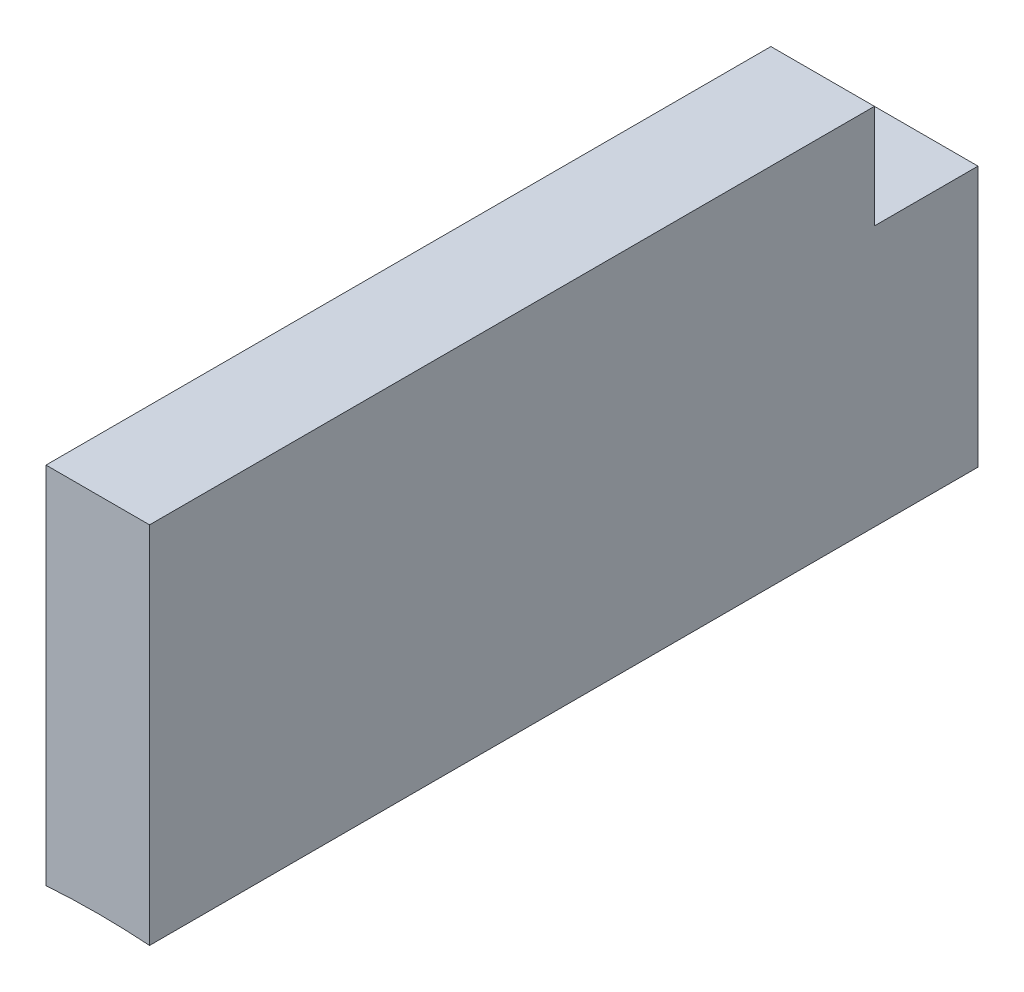
ISO-10303-21;
HEADER;
FILE_DESCRIPTION(('STEP AP214'),'2;1');
FILE_NAME('part.step','',(''),(''),'','','');
FILE_SCHEMA(('AUTOMOTIVE_DESIGN { 1 0 10303 214 1 1 1 1 }'));
ENDSEC;
DATA;
#1=APPLICATION_CONTEXT('core data for automotive mechanical design processes');
#2=APPLICATION_PROTOCOL_DEFINITION('international standard','automotive_design',2000,#1);
#3=PRODUCT_CONTEXT('',#1,'mechanical');
#4=PRODUCT('Part','Part','',(#3));
#5=PRODUCT_RELATED_PRODUCT_CATEGORY('part','',(#4));
#6=PRODUCT_DEFINITION_FORMATION('','',#4);
#7=PRODUCT_DEFINITION_CONTEXT('part definition',#1,'design');
#8=PRODUCT_DEFINITION('design','',#6,#7);
#9=PRODUCT_DEFINITION_SHAPE('','',#8);
#10=(LENGTH_UNIT() NAMED_UNIT(*) SI_UNIT(.MILLI.,.METRE.));
#11=(NAMED_UNIT(*) PLANE_ANGLE_UNIT() SI_UNIT($,.RADIAN.));
#12=(NAMED_UNIT(*) SI_UNIT($,.STERADIAN.) SOLID_ANGLE_UNIT());
#13=UNCERTAINTY_MEASURE_WITH_UNIT(LENGTH_MEASURE(1.E-05),#10,'distance_accuracy_value','');
#14=(GEOMETRIC_REPRESENTATION_CONTEXT(3) GLOBAL_UNCERTAINTY_ASSIGNED_CONTEXT((#13)) GLOBAL_UNIT_ASSIGNED_CONTEXT((#10,
#11,#12)) REPRESENTATION_CONTEXT('',''));
#15=CARTESIAN_POINT('',(0.,0.,0.));
#16=DIRECTION('',(0.,0.,1.));
#17=DIRECTION('',(1.,0.,0.));
#18=AXIS2_PLACEMENT_3D('',#15,#16,#17);
#19=CARTESIAN_POINT('',(-2.5,-53.,40.));
#20=DIRECTION('',(0.,0.,-1.));
#21=DIRECTION('',(-1.,0.,0.));
#22=AXIS2_PLACEMENT_3D('',#19,#20,#21);
#23=CYLINDRICAL_SURFACE('',#22,35.5);
#24=CARTESIAN_POINT('',(-2.5,-53.,0.));
#25=DIRECTION('',(0.,0.,1.));
#26=DIRECTION('',(1.,0.,0.));
#27=AXIS2_PLACEMENT_3D('',#24,#25,#26);
#28=CIRCLE('',#27,35.5);
#29=CARTESIAN_POINT('',(0.,-17.5881375807484,0.));
#30=VERTEX_POINT('',#29);
#31=CARTESIAN_POINT('',(-5.,-17.5881375807484,0.));
#32=VERTEX_POINT('',#31);
#33=EDGE_CURVE('E115',#30,#32,#28,.T.);
#34=ORIENTED_EDGE('',*,*,#33,.F.);
#35=DIRECTION('',(0.,0.,-1.));
#36=VECTOR('',#35,1.);
#37=CARTESIAN_POINT('',(0.,-17.5881375807484,40.));
#38=LINE('',#37,#36);
#39=CARTESIAN_POINT('',(0.,-17.5881375807484,40.));
#40=VERTEX_POINT('',#39);
#41=EDGE_CURVE('E75',#40,#30,#38,.T.);
#42=ORIENTED_EDGE('',*,*,#41,.F.);
#43=CARTESIAN_POINT('',(-2.5,-53.,40.));
#44=DIRECTION('',(0.,0.,1.));
#45=DIRECTION('',(1.,0.,0.));
#46=AXIS2_PLACEMENT_3D('',#43,#44,#45);
#47=CIRCLE('',#46,35.5);
#48=CARTESIAN_POINT('',(-5.,-17.5881375807484,40.));
#49=VERTEX_POINT('',#48);
#50=EDGE_CURVE('E116',#40,#49,#47,.T.);
#51=ORIENTED_EDGE('',*,*,#50,.T.);
#52=DIRECTION('',(0.,0.,-1.));
#53=VECTOR('',#52,1.);
#54=CARTESIAN_POINT('',(-5.,-17.5881375807484,40.));
#55=LINE('',#54,#53);
#56=EDGE_CURVE('E58',#49,#32,#55,.T.);
#57=ORIENTED_EDGE('',*,*,#56,.T.);
#58=EDGE_LOOP('',(#34,#42,#51,#57));
#59=FACE_BOUND('',#58,.T.);
#60=ADVANCED_FACE('F35',(#59),#23,.F.);
#61=CARTESIAN_POINT('',(0.,0.,40.));
#62=DIRECTION('',(-1.,0.,0.));
#63=DIRECTION('',(0.,0.,1.));
#64=AXIS2_PLACEMENT_3D('',#61,#62,#63);
#65=PLANE('',#64);
#66=DIRECTION('',(0.,0.,-1.));
#67=VECTOR('',#66,1.);
#68=CARTESIAN_POINT('',(0.,-5.,5.));
#69=LINE('',#68,#67);
#70=CARTESIAN_POINT('',(0.,-5.,5.));
#71=VERTEX_POINT('',#70);
#72=CARTESIAN_POINT('',(0.,-5.,0.));
#73=VERTEX_POINT('',#72);
#74=EDGE_CURVE('E49',#71,#73,#69,.T.);
#75=ORIENTED_EDGE('',*,*,#74,.F.);
#76=DIRECTION('',(0.,-1.,0.));
#77=VECTOR('',#76,1.);
#78=CARTESIAN_POINT('',(0.,0.,5.));
#79=LINE('',#78,#77);
#80=CARTESIAN_POINT('',(0.,0.,5.));
#81=VERTEX_POINT('',#80);
#82=EDGE_CURVE('E100',#81,#71,#79,.T.);
#83=ORIENTED_EDGE('',*,*,#82,.F.);
#84=DIRECTION('',(0.,0.,-1.));
#85=VECTOR('',#84,1.);
#86=CARTESIAN_POINT('',(0.,0.,40.));
#87=LINE('',#86,#85);
#88=CARTESIAN_POINT('',(0.,0.,40.));
#89=VERTEX_POINT('',#88);
#90=EDGE_CURVE('E134',#89,#81,#87,.T.);
#91=ORIENTED_EDGE('',*,*,#90,.F.);
#92=DIRECTION('',(0.,1.,0.));
#93=VECTOR('',#92,1.);
#94=CARTESIAN_POINT('',(0.,0.,40.));
#95=LINE('',#94,#93);
#96=EDGE_CURVE('E118',#40,#89,#95,.T.);
#97=ORIENTED_EDGE('',*,*,#96,.F.);
#98=ORIENTED_EDGE('',*,*,#41,.T.);
#99=DIRECTION('',(0.,1.,0.));
#100=VECTOR('',#99,1.);
#101=CARTESIAN_POINT('',(0.,0.,0.));
#102=LINE('',#101,#100);
#103=EDGE_CURVE('E110',#30,#73,#102,.T.);
#104=ORIENTED_EDGE('',*,*,#103,.T.);
#105=EDGE_LOOP('',(#75,#83,#91,#97,#98,#104));
#106=FACE_BOUND('',#105,.T.);
#107=ADVANCED_FACE('F108',(#106),#65,.F.);
#108=CARTESIAN_POINT('',(0.,0.,40.));
#109=DIRECTION('',(0.,1.,0.));
#110=DIRECTION('',(0.,0.,1.));
#111=AXIS2_PLACEMENT_3D('',#108,#109,#110);
#112=PLANE('',#111);
#113=DIRECTION('',(1.,0.,0.));
#114=VECTOR('',#113,1.);
#115=CARTESIAN_POINT('',(-10.,0.,5.));
#116=LINE('',#115,#114);
#117=CARTESIAN_POINT('',(-5.,0.,5.));
#118=VERTEX_POINT('',#117);
#119=EDGE_CURVE('E97',#118,#81,#116,.T.);
#120=ORIENTED_EDGE('',*,*,#119,.F.);
#121=DIRECTION('',(0.,0.,-1.));
#122=VECTOR('',#121,1.);
#123=CARTESIAN_POINT('',(-5.,0.,40.));
#124=LINE('',#123,#122);
#125=CARTESIAN_POINT('',(-5.,0.,40.));
#126=VERTEX_POINT('',#125);
#127=EDGE_CURVE('E131',#126,#118,#124,.T.);
#128=ORIENTED_EDGE('',*,*,#127,.F.);
#129=DIRECTION('',(1.,0.,0.));
#130=VECTOR('',#129,1.);
#131=CARTESIAN_POINT('',(0.,0.,40.));
#132=LINE('',#131,#130);
#133=EDGE_CURVE('E121',#126,#89,#132,.T.);
#134=ORIENTED_EDGE('',*,*,#133,.T.);
#135=ORIENTED_EDGE('',*,*,#90,.T.);
#136=EDGE_LOOP('',(#120,#128,#134,#135));
#137=FACE_BOUND('',#136,.T.);
#138=ADVANCED_FACE('F140',(#137),#112,.T.);
#139=CARTESIAN_POINT('',(-5.,0.,40.));
#140=DIRECTION('',(-1.,0.,0.));
#141=DIRECTION('',(0.,0.,1.));
#142=AXIS2_PLACEMENT_3D('',#139,#140,#141);
#143=PLANE('',#142);
#144=DIRECTION('',(0.,1.,0.));
#145=VECTOR('',#144,1.);
#146=CARTESIAN_POINT('',(-5.,0.,5.));
#147=LINE('',#146,#145);
#148=CARTESIAN_POINT('',(-5.,-5.,5.));
#149=VERTEX_POINT('',#148);
#150=EDGE_CURVE('E11',#149,#118,#147,.T.);
#151=ORIENTED_EDGE('',*,*,#150,.F.);
#152=DIRECTION('',(0.,0.,1.));
#153=VECTOR('',#152,1.);
#154=CARTESIAN_POINT('',(-5.,-5.,40.));
#155=LINE('',#154,#153);
#156=CARTESIAN_POINT('',(-5.,-5.,0.));
#157=VERTEX_POINT('',#156);
#158=EDGE_CURVE('E94',#157,#149,#155,.T.);
#159=ORIENTED_EDGE('',*,*,#158,.F.);
#160=DIRECTION('',(0.,1.,0.));
#161=VECTOR('',#160,1.);
#162=CARTESIAN_POINT('',(-5.,0.,0.));
#163=LINE('',#162,#161);
#164=EDGE_CURVE('E119',#32,#157,#163,.T.);
#165=ORIENTED_EDGE('',*,*,#164,.F.);
#166=ORIENTED_EDGE('',*,*,#56,.F.);
#167=DIRECTION('',(0.,1.,0.));
#168=VECTOR('',#167,1.);
#169=CARTESIAN_POINT('',(-5.,0.,40.));
#170=LINE('',#169,#168);
#171=EDGE_CURVE('E124',#49,#126,#170,.T.);
#172=ORIENTED_EDGE('',*,*,#171,.T.);
#173=ORIENTED_EDGE('',*,*,#127,.T.);
#174=EDGE_LOOP('',(#151,#159,#165,#166,#172,#173));
#175=FACE_BOUND('',#174,.T.);
#176=ADVANCED_FACE('F138',(#175),#143,.T.);
#177=CARTESIAN_POINT('',(0.,0.,40.));
#178=DIRECTION('',(0.,0.,1.));
#179=DIRECTION('',(1.,0.,0.));
#180=AXIS2_PLACEMENT_3D('',#177,#178,#179);
#181=PLANE('',#180);
#182=ORIENTED_EDGE('',*,*,#50,.F.);
#183=ORIENTED_EDGE('',*,*,#96,.T.);
#184=ORIENTED_EDGE('',*,*,#133,.F.);
#185=ORIENTED_EDGE('',*,*,#171,.F.);
#186=EDGE_LOOP('',(#182,#183,#184,#185));
#187=FACE_BOUND('',#186,.T.);
#188=ADVANCED_FACE('F145',(#187),#181,.T.);
#189=CARTESIAN_POINT('',(0.,0.,0.));
#190=DIRECTION('',(0.,0.,1.));
#191=DIRECTION('',(1.,0.,0.));
#192=AXIS2_PLACEMENT_3D('',#189,#190,#191);
#193=PLANE('',#192);
#194=ORIENTED_EDGE('',*,*,#164,.T.);
#195=DIRECTION('',(1.,0.,0.));
#196=VECTOR('',#195,1.);
#197=CARTESIAN_POINT('',(0.,-5.,0.));
#198=LINE('',#197,#196);
#199=EDGE_CURVE('E42',#157,#73,#198,.T.);
#200=ORIENTED_EDGE('',*,*,#199,.T.);
#201=ORIENTED_EDGE('',*,*,#103,.F.);
#202=ORIENTED_EDGE('',*,*,#33,.T.);
#203=EDGE_LOOP('',(#194,#200,#201,#202));
#204=FACE_BOUND('',#203,.T.);
#205=ADVANCED_FACE('F137',(#204),#193,.F.);
#206=CARTESIAN_POINT('',(-10.,0.,5.));
#207=DIRECTION('',(0.,0.,1.));
#208=DIRECTION('',(0.,-1.,0.));
#209=AXIS2_PLACEMENT_3D('',#206,#207,#208);
#210=PLANE('',#209);
#211=ORIENTED_EDGE('',*,*,#150,.T.);
#212=ORIENTED_EDGE('',*,*,#119,.T.);
#213=ORIENTED_EDGE('',*,*,#82,.T.);
#214=DIRECTION('',(1.,0.,0.));
#215=VECTOR('',#214,1.);
#216=CARTESIAN_POINT('',(-10.,-5.,5.));
#217=LINE('',#216,#215);
#218=EDGE_CURVE('E90',#149,#71,#217,.T.);
#219=ORIENTED_EDGE('',*,*,#218,.F.);
#220=EDGE_LOOP('',(#211,#212,#213,#219));
#221=FACE_BOUND('',#220,.T.);
#222=ADVANCED_FACE('F101',(#221),#210,.F.);
#223=CARTESIAN_POINT('',(-10.,-5.,5.));
#224=DIRECTION('',(0.,-1.,0.));
#225=DIRECTION('',(0.,0.,-1.));
#226=AXIS2_PLACEMENT_3D('',#223,#224,#225);
#227=PLANE('',#226);
#228=ORIENTED_EDGE('',*,*,#158,.T.);
#229=ORIENTED_EDGE('',*,*,#218,.T.);
#230=ORIENTED_EDGE('',*,*,#74,.T.);
#231=ORIENTED_EDGE('',*,*,#199,.F.);
#232=EDGE_LOOP('',(#228,#229,#230,#231));
#233=FACE_BOUND('',#232,.T.);
#234=ADVANCED_FACE('F92',(#233),#227,.F.);
#235=CLOSED_SHELL('',(#60,#107,#138,#176,#188,#205,#222,#234));
#236=MANIFOLD_SOLID_BREP('B2',#235);
#237=ADVANCED_BREP_SHAPE_REPRESENTATION('',(#18,#236),#14);
#238=SHAPE_DEFINITION_REPRESENTATION(#9,#237);
ENDSEC;
END-ISO-10303-21;
